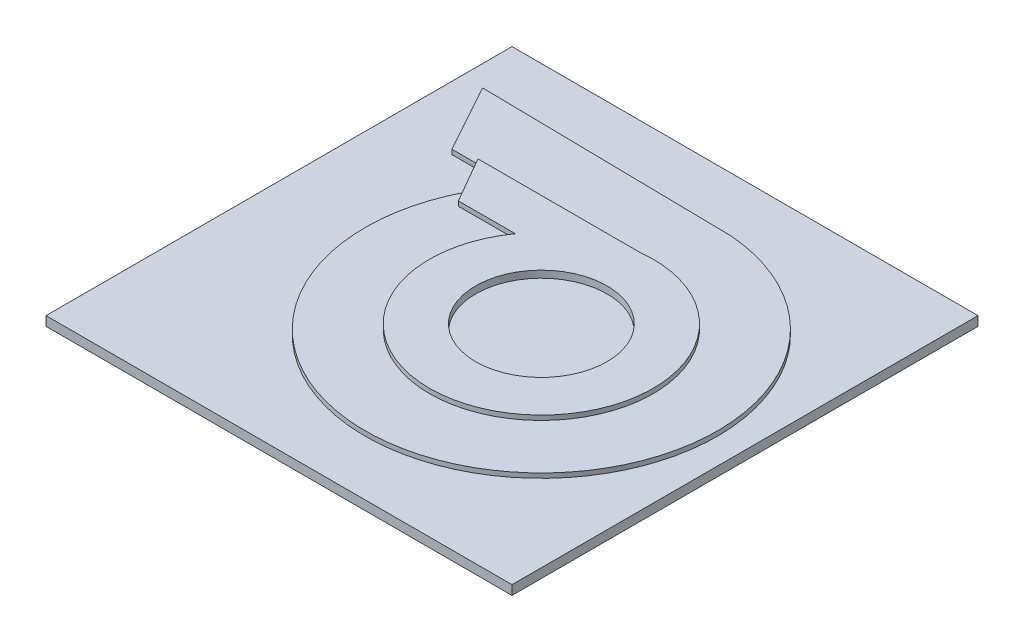
ISO-10303-21;
HEADER;
FILE_DESCRIPTION(('STEP AP214'),'2;1');
FILE_NAME('part.step','',(''),(''),'','','');
FILE_SCHEMA(('AUTOMOTIVE_DESIGN { 1 0 10303 214 1 1 1 1 }'));
ENDSEC;
DATA;
#1=APPLICATION_CONTEXT('core data for automotive mechanical design processes');
#2=APPLICATION_PROTOCOL_DEFINITION('international standard','automotive_design',2000,#1);
#3=PRODUCT_CONTEXT('',#1,'mechanical');
#4=PRODUCT('Part','Part','',(#3));
#5=PRODUCT_RELATED_PRODUCT_CATEGORY('part','',(#4));
#6=PRODUCT_DEFINITION_FORMATION('','',#4);
#7=PRODUCT_DEFINITION_CONTEXT('part definition',#1,'design');
#8=PRODUCT_DEFINITION('design','',#6,#7);
#9=PRODUCT_DEFINITION_SHAPE('','',#8);
#10=(LENGTH_UNIT() NAMED_UNIT(*) SI_UNIT(.MILLI.,.METRE.));
#11=(NAMED_UNIT(*) PLANE_ANGLE_UNIT() SI_UNIT($,.RADIAN.));
#12=(NAMED_UNIT(*) SI_UNIT($,.STERADIAN.) SOLID_ANGLE_UNIT());
#13=UNCERTAINTY_MEASURE_WITH_UNIT(LENGTH_MEASURE(1.E-05),#10,'distance_accuracy_value','');
#14=(GEOMETRIC_REPRESENTATION_CONTEXT(3) GLOBAL_UNCERTAINTY_ASSIGNED_CONTEXT((#13)) GLOBAL_UNIT_ASSIGNED_CONTEXT((#10,
#11,#12)) REPRESENTATION_CONTEXT('',''));
#15=CARTESIAN_POINT('',(0.,0.,0.));
#16=DIRECTION('',(0.,0.,1.));
#17=DIRECTION('',(1.,0.,0.));
#18=AXIS2_PLACEMENT_3D('',#15,#16,#17);
#19=CARTESIAN_POINT('',(-50.,2.,-50.));
#20=DIRECTION('',(1.,0.,0.));
#21=DIRECTION('',(0.,0.,-1.));
#22=AXIS2_PLACEMENT_3D('',#19,#20,#21);
#23=PLANE('',#22);
#24=DIRECTION('',(0.,0.,1.));
#25=VECTOR('',#24,1.);
#26=CARTESIAN_POINT('',(-50.,0.,-50.));
#27=LINE('',#26,#25);
#28=CARTESIAN_POINT('',(-50.,0.,-50.));
#29=VERTEX_POINT('',#28);
#30=CARTESIAN_POINT('',(-50.,0.,50.));
#31=VERTEX_POINT('',#30);
#32=EDGE_CURVE('E246',#29,#31,#27,.T.);
#33=ORIENTED_EDGE('',*,*,#32,.T.);
#34=DIRECTION('',(0.,-1.,0.));
#35=VECTOR('',#34,1.);
#36=CARTESIAN_POINT('',(-50.,2.,50.));
#37=LINE('',#36,#35);
#38=CARTESIAN_POINT('',(-50.,2.,50.));
#39=VERTEX_POINT('',#38);
#40=EDGE_CURVE('E74',#39,#31,#37,.T.);
#41=ORIENTED_EDGE('',*,*,#40,.F.);
#42=DIRECTION('',(0.,0.,1.));
#43=VECTOR('',#42,1.);
#44=CARTESIAN_POINT('',(-50.,2.,-50.));
#45=LINE('',#44,#43);
#46=CARTESIAN_POINT('',(-50.,2.,-50.));
#47=VERTEX_POINT('',#46);
#48=EDGE_CURVE('E247',#47,#39,#45,.T.);
#49=ORIENTED_EDGE('',*,*,#48,.F.);
#50=DIRECTION('',(0.,-1.,0.));
#51=VECTOR('',#50,1.);
#52=CARTESIAN_POINT('',(-50.,2.,-50.));
#53=LINE('',#52,#51);
#54=EDGE_CURVE('E261',#47,#29,#53,.T.);
#55=ORIENTED_EDGE('',*,*,#54,.T.);
#56=EDGE_LOOP('',(#33,#41,#49,#55));
#57=FACE_BOUND('',#56,.T.);
#58=ADVANCED_FACE('F71',(#57),#23,.F.);
#59=CARTESIAN_POINT('',(-50.,2.,50.));
#60=DIRECTION('',(0.,0.,-1.));
#61=DIRECTION('',(-1.,0.,0.));
#62=AXIS2_PLACEMENT_3D('',#59,#60,#61);
#63=PLANE('',#62);
#64=DIRECTION('',(1.,0.,0.));
#65=VECTOR('',#64,1.);
#66=CARTESIAN_POINT('',(-50.,0.,50.));
#67=LINE('',#66,#65);
#68=CARTESIAN_POINT('',(50.,0.,50.));
#69=VERTEX_POINT('',#68);
#70=EDGE_CURVE('E265',#31,#69,#67,.T.);
#71=ORIENTED_EDGE('',*,*,#70,.T.);
#72=DIRECTION('',(0.,-1.,0.));
#73=VECTOR('',#72,1.);
#74=CARTESIAN_POINT('',(50.,2.,50.));
#75=LINE('',#74,#73);
#76=CARTESIAN_POINT('',(50.,2.,50.));
#77=VERTEX_POINT('',#76);
#78=EDGE_CURVE('E279',#77,#69,#75,.T.);
#79=ORIENTED_EDGE('',*,*,#78,.F.);
#80=DIRECTION('',(1.,0.,0.));
#81=VECTOR('',#80,1.);
#82=CARTESIAN_POINT('',(-50.,2.,50.));
#83=LINE('',#82,#81);
#84=EDGE_CURVE('E251',#39,#77,#83,.T.);
#85=ORIENTED_EDGE('',*,*,#84,.F.);
#86=ORIENTED_EDGE('',*,*,#40,.T.);
#87=EDGE_LOOP('',(#71,#79,#85,#86));
#88=FACE_BOUND('',#87,.T.);
#89=ADVANCED_FACE('F290',(#88),#63,.F.);
#90=CARTESIAN_POINT('',(50.,2.,-50.));
#91=DIRECTION('',(-1.,0.,0.));
#92=DIRECTION('',(0.,0.,1.));
#93=AXIS2_PLACEMENT_3D('',#90,#91,#92);
#94=PLANE('',#93);
#95=DIRECTION('',(0.,0.,-1.));
#96=VECTOR('',#95,1.);
#97=CARTESIAN_POINT('',(50.,0.,-50.));
#98=LINE('',#97,#96);
#99=CARTESIAN_POINT('',(50.,0.,-50.));
#100=VERTEX_POINT('',#99);
#101=EDGE_CURVE('E268',#69,#100,#98,.T.);
#102=ORIENTED_EDGE('',*,*,#101,.T.);
#103=DIRECTION('',(0.,-1.,0.));
#104=VECTOR('',#103,1.);
#105=CARTESIAN_POINT('',(50.,2.,-50.));
#106=LINE('',#105,#104);
#107=CARTESIAN_POINT('',(50.,2.,-50.));
#108=VERTEX_POINT('',#107);
#109=EDGE_CURVE('E276',#108,#100,#106,.T.);
#110=ORIENTED_EDGE('',*,*,#109,.F.);
#111=DIRECTION('',(0.,0.,-1.));
#112=VECTOR('',#111,1.);
#113=CARTESIAN_POINT('',(50.,2.,-50.));
#114=LINE('',#113,#112);
#115=EDGE_CURVE('E255',#77,#108,#114,.T.);
#116=ORIENTED_EDGE('',*,*,#115,.F.);
#117=ORIENTED_EDGE('',*,*,#78,.T.);
#118=EDGE_LOOP('',(#102,#110,#116,#117));
#119=FACE_BOUND('',#118,.T.);
#120=ADVANCED_FACE('F299',(#119),#94,.F.);
#121=CARTESIAN_POINT('',(-50.,2.,-50.));
#122=DIRECTION('',(0.,0.,1.));
#123=DIRECTION('',(1.,0.,0.));
#124=AXIS2_PLACEMENT_3D('',#121,#122,#123);
#125=PLANE('',#124);
#126=DIRECTION('',(-1.,0.,0.));
#127=VECTOR('',#126,1.);
#128=CARTESIAN_POINT('',(-50.,0.,-50.));
#129=LINE('',#128,#127);
#130=EDGE_CURVE('E252',#100,#29,#129,.T.);
#131=ORIENTED_EDGE('',*,*,#130,.T.);
#132=ORIENTED_EDGE('',*,*,#54,.F.);
#133=DIRECTION('',(-1.,0.,0.));
#134=VECTOR('',#133,1.);
#135=CARTESIAN_POINT('',(-50.,2.,-50.));
#136=LINE('',#135,#134);
#137=EDGE_CURVE('E258',#108,#47,#136,.T.);
#138=ORIENTED_EDGE('',*,*,#137,.F.);
#139=ORIENTED_EDGE('',*,*,#109,.T.);
#140=EDGE_LOOP('',(#131,#132,#138,#139));
#141=FACE_BOUND('',#140,.T.);
#142=ADVANCED_FACE('F302',(#141),#125,.F.);
#143=CARTESIAN_POINT('',(0.,2.,0.));
#144=DIRECTION('',(0.,1.,0.));
#145=DIRECTION('',(0.,0.,1.));
#146=AXIS2_PLACEMENT_3D('',#143,#144,#145);
#147=PLANE('',#146);
#148=DIRECTION('',(0.498964444867146,0.,0.866622456874053));
#149=VECTOR('',#148,1.);
#150=CARTESIAN_POINT('',(-30.8341006366338,2.,-23.5717088899984));
#151=LINE('',#150,#149);
#152=CARTESIAN_POINT('',(-30.7809942028032,2.,-23.4794713996611));
#153=VERTEX_POINT('',#152);
#154=CARTESIAN_POINT('',(-26.9748024784057,2.,-16.8687173520269));
#155=VERTEX_POINT('',#154);
#156=EDGE_CURVE('E188',#153,#155,#151,.T.);
#157=ORIENTED_EDGE('',*,*,#156,.F.);
#158=DIRECTION('',(1.,0.,0.));
#159=VECTOR('',#158,1.);
#160=CARTESIAN_POINT('',(-36.3730302687271,2.,-23.4794713996611));
#161=LINE('',#160,#159);
#162=CARTESIAN_POINT('',(-36.3730302687271,2.,-23.4794713996611));
#163=VERTEX_POINT('',#162);
#164=EDGE_CURVE('E218',#163,#153,#161,.T.);
#165=ORIENTED_EDGE('',*,*,#164,.F.);
#166=DIRECTION('',(0.482604753647141,0.,0.87583825661887));
#167=VECTOR('',#166,1.);
#168=CARTESIAN_POINT('',(-44.4637049264599,2.,-38.1625476303611));
#169=LINE('',#168,#167);
#170=CARTESIAN_POINT('',(-44.4637049264599,2.,-38.1625476303611));
#171=VERTEX_POINT('',#170);
#172=EDGE_CURVE('E193',#171,#163,#169,.T.);
#173=ORIENTED_EDGE('',*,*,#172,.F.);
#174=DIRECTION('',(0.999875736676544,0.,0.0157642381845526));
#175=VECTOR('',#174,1.);
#176=CARTESIAN_POINT('',(-44.4637049264599,2.,-38.1625476303611));
#177=LINE('',#176,#175);
#178=CARTESIAN_POINT('',(9.74071455156101,2.,-37.3079500559194));
#179=VERTEX_POINT('',#178);
#180=EDGE_CURVE('E204',#171,#179,#177,.T.);
#181=ORIENTED_EDGE('',*,*,#180,.T.);
#182=CARTESIAN_POINT('',(6.6658156921361,2.,0.364658396037882));
#183=DIRECTION('',(0.,1.,0.));
#184=DIRECTION('',(0.,0.,1.));
#185=AXIS2_PLACEMENT_3D('',#182,#183,#184);
#186=CIRCLE('',#185,37.7978892343233);
#187=EDGE_CURVE('E222',#155,#179,#186,.T.);
#188=ORIENTED_EDGE('',*,*,#187,.F.);
#189=EDGE_LOOP('',(#157,#165,#173,#181,#188));
#190=FACE_BOUND('',#189,.T.);
#191=ORIENTED_EDGE('',*,*,#48,.T.);
#192=ORIENTED_EDGE('',*,*,#84,.T.);
#193=ORIENTED_EDGE('',*,*,#115,.T.);
#194=ORIENTED_EDGE('',*,*,#137,.T.);
#195=EDGE_LOOP('',(#191,#192,#193,#194));
#196=FACE_BOUND('',#195,.T.);
#197=ADVANCED_FACE('F304',(#190,#196),#147,.T.);
#198=CARTESIAN_POINT('',(0.,0.,0.));
#199=DIRECTION('',(0.,1.,0.));
#200=DIRECTION('',(0.,0.,1.));
#201=AXIS2_PLACEMENT_3D('',#198,#199,#200);
#202=PLANE('',#201);
#203=ORIENTED_EDGE('',*,*,#32,.F.);
#204=ORIENTED_EDGE('',*,*,#130,.F.);
#205=ORIENTED_EDGE('',*,*,#101,.F.);
#206=ORIENTED_EDGE('',*,*,#70,.F.);
#207=EDGE_LOOP('',(#203,#204,#205,#206));
#208=FACE_BOUND('',#207,.T.);
#209=ADVANCED_FACE('F297',(#208),#202,.F.);
#210=CARTESIAN_POINT('',(6.6658156921361,3.,0.364658396037882));
#211=DIRECTION('',(0.,1.,0.));
#212=DIRECTION('',(0.,0.,1.));
#213=AXIS2_PLACEMENT_3D('',#210,#211,#212);
#214=PLANE('',#213);
#215=DIRECTION('',(0.498964444867147,0.,0.866622456874053));
#216=VECTOR('',#215,1.);
#217=CARTESIAN_POINT('',(-30.7809942028031,3.,-23.4794713996611));
#218=LINE('',#217,#216);
#219=CARTESIAN_POINT('',(-26.9748024784057,3.,-16.8687173520269));
#220=VERTEX_POINT('',#219);
#221=CARTESIAN_POINT('',(-25.0717356927442,3.,-13.563390829564));
#222=VERTEX_POINT('',#221);
#223=EDGE_CURVE('E12',#220,#222,#218,.T.);
#224=ORIENTED_EDGE('',*,*,#223,.F.);
#225=CARTESIAN_POINT('',(6.6658156921361,3.,0.364658396037882));
#226=DIRECTION('',(0.,1.,0.));
#227=DIRECTION('',(0.,0.,1.));
#228=AXIS2_PLACEMENT_3D('',#225,#226,#227);
#229=CIRCLE('',#228,37.7978892343233);
#230=CARTESIAN_POINT('',(9.74071455156101,3.,-37.3079500559194));
#231=VERTEX_POINT('',#230);
#232=EDGE_CURVE('E207',#220,#231,#229,.T.);
#233=ORIENTED_EDGE('',*,*,#232,.T.);
#234=DIRECTION('',(0.999875736676544,0.,0.0157642381845526));
#235=VECTOR('',#234,1.);
#236=CARTESIAN_POINT('',(-44.4637049264599,3.,-38.1625476303611));
#237=LINE('',#236,#235);
#238=CARTESIAN_POINT('',(-44.4637049264599,3.,-38.1625476303611));
#239=VERTEX_POINT('',#238);
#240=EDGE_CURVE('E210',#239,#231,#237,.T.);
#241=ORIENTED_EDGE('',*,*,#240,.F.);
#242=DIRECTION('',(0.482604753647141,0.,0.87583825661887));
#243=VECTOR('',#242,1.);
#244=CARTESIAN_POINT('',(-44.4637049264599,3.,-38.1625476303611));
#245=LINE('',#244,#243);
#246=CARTESIAN_POINT('',(-36.3730302687271,3.,-23.4794713996611));
#247=VERTEX_POINT('',#246);
#248=EDGE_CURVE('E199',#239,#247,#245,.T.);
#249=ORIENTED_EDGE('',*,*,#248,.T.);
#250=DIRECTION('',(1.,0.,0.));
#251=VECTOR('',#250,1.);
#252=CARTESIAN_POINT('',(-36.3730302687271,3.,-23.4794713996611));
#253=LINE('',#252,#251);
#254=CARTESIAN_POINT('',(-30.7809942028032,3.,-23.4794713996611));
#255=VERTEX_POINT('',#254);
#256=EDGE_CURVE('E203',#247,#255,#253,.T.);
#257=ORIENTED_EDGE('',*,*,#256,.T.);
#258=DIRECTION('',(1.,0.,0.));
#259=VECTOR('',#258,1.);
#260=CARTESIAN_POINT('',(-30.7809942028031,3.,-23.4794713996611));
#261=LINE('',#260,#259);
#262=CARTESIAN_POINT('',(3.93497803935275,3.,-23.4794713996611));
#263=VERTEX_POINT('',#262);
#264=EDGE_CURVE('E87',#255,#263,#261,.T.);
#265=ORIENTED_EDGE('',*,*,#264,.T.);
#266=CARTESIAN_POINT('',(6.66581569213555,3.,0.364658396037981));
#267=DIRECTION('',(0.,1.,0.));
#268=DIRECTION('',(0.,0.,1.));
#269=AXIS2_PLACEMENT_3D('',#266,#267,#268);
#270=CIRCLE('',#269,24.);
#271=CARTESIAN_POINT('',(-12.8657271303701,3.,-13.5823425350808));
#272=VERTEX_POINT('',#271);
#273=EDGE_CURVE('E480',#272,#263,#270,.T.);
#274=ORIENTED_EDGE('',*,*,#273,.F.);
#275=DIRECTION('',(0.999998794635276,0.,-0.0015526519235439));
#276=VECTOR('',#275,1.);
#277=CARTESIAN_POINT('',(-25.0717356927442,3.,-13.563390829564));
#278=LINE('',#277,#276);
#279=EDGE_CURVE('E93',#222,#272,#278,.T.);
#280=ORIENTED_EDGE('',*,*,#279,.F.);
#281=EDGE_LOOP('',(#224,#233,#241,#249,#257,#265,#274,#280));
#282=FACE_BOUND('',#281,.T.);
#283=ADVANCED_FACE('F312',(#282),#214,.T.);
#284=CARTESIAN_POINT('',(6.6658156921361,3.,0.364658396037882));
#285=DIRECTION('',(0.,-1.,0.));
#286=DIRECTION('',(0.,0.,-1.));
#287=AXIS2_PLACEMENT_3D('',#284,#285,#286);
#288=CYLINDRICAL_SURFACE('',#287,37.7978892343233);
#289=DIRECTION('',(0.,-1.,0.));
#290=VECTOR('',#289,1.);
#291=CARTESIAN_POINT('',(-26.9748024784057,3.,-16.8687173520269));
#292=LINE('',#291,#290);
#293=EDGE_CURVE('E238',#155,#220,#292,.F.);
#294=ORIENTED_EDGE('',*,*,#293,.F.);
#295=ORIENTED_EDGE('',*,*,#187,.T.);
#296=DIRECTION('',(0.,-1.,0.));
#297=VECTOR('',#296,1.);
#298=CARTESIAN_POINT('',(9.74071455156101,3.,-37.3079500559194));
#299=LINE('',#298,#297);
#300=EDGE_CURVE('E231',#231,#179,#299,.T.);
#301=ORIENTED_EDGE('',*,*,#300,.F.);
#302=ORIENTED_EDGE('',*,*,#232,.F.);
#303=EDGE_LOOP('',(#294,#295,#301,#302));
#304=FACE_BOUND('',#303,.T.);
#305=ADVANCED_FACE('F314',(#304),#288,.T.);
#306=CARTESIAN_POINT('',(-44.4637049264599,3.,-38.1625476303611));
#307=DIRECTION('',(0.0157642381845526,0.,-0.999875736676544));
#308=DIRECTION('',(-0.999875736676544,0.,-0.0157642381845526));
#309=AXIS2_PLACEMENT_3D('',#306,#307,#308);
#310=PLANE('',#309);
#311=ORIENTED_EDGE('',*,*,#180,.F.);
#312=DIRECTION('',(0.,-1.,0.));
#313=VECTOR('',#312,1.);
#314=CARTESIAN_POINT('',(-44.4637049264599,3.,-38.1625476303611));
#315=LINE('',#314,#313);
#316=EDGE_CURVE('E214',#239,#171,#315,.T.);
#317=ORIENTED_EDGE('',*,*,#316,.F.);
#318=ORIENTED_EDGE('',*,*,#240,.T.);
#319=ORIENTED_EDGE('',*,*,#300,.T.);
#320=EDGE_LOOP('',(#311,#317,#318,#319));
#321=FACE_BOUND('',#320,.T.);
#322=ADVANCED_FACE('F366',(#321),#310,.T.);
#323=CARTESIAN_POINT('',(-44.4637049264599,3.,-38.1625476303611));
#324=DIRECTION('',(0.87583825661887,0.,-0.482604753647141));
#325=DIRECTION('',(-0.482604753647141,0.,-0.87583825661887));
#326=AXIS2_PLACEMENT_3D('',#323,#324,#325);
#327=PLANE('',#326);
#328=ORIENTED_EDGE('',*,*,#172,.T.);
#329=DIRECTION('',(0.,-1.,0.));
#330=VECTOR('',#329,1.);
#331=CARTESIAN_POINT('',(-36.3730302687271,3.,-23.4794713996611));
#332=LINE('',#331,#330);
#333=EDGE_CURVE('E235',#247,#163,#332,.T.);
#334=ORIENTED_EDGE('',*,*,#333,.F.);
#335=ORIENTED_EDGE('',*,*,#248,.F.);
#336=ORIENTED_EDGE('',*,*,#316,.T.);
#337=EDGE_LOOP('',(#328,#334,#335,#336));
#338=FACE_BOUND('',#337,.T.);
#339=ADVANCED_FACE('F377',(#338),#327,.F.);
#340=CARTESIAN_POINT('',(-36.3730302687271,3.,-23.4794713996611));
#341=DIRECTION('',(0.,0.,-1.));
#342=DIRECTION('',(-1.,0.,0.));
#343=AXIS2_PLACEMENT_3D('',#340,#341,#342);
#344=PLANE('',#343);
#345=DIRECTION('',(0.,-1.,0.));
#346=VECTOR('',#345,1.);
#347=CARTESIAN_POINT('',(-30.7809942028032,3.,-23.4794713996611));
#348=LINE('',#347,#346);
#349=EDGE_CURVE('E242',#255,#153,#348,.T.);
#350=ORIENTED_EDGE('',*,*,#349,.F.);
#351=ORIENTED_EDGE('',*,*,#256,.F.);
#352=ORIENTED_EDGE('',*,*,#333,.T.);
#353=ORIENTED_EDGE('',*,*,#164,.T.);
#354=EDGE_LOOP('',(#350,#351,#352,#353));
#355=FACE_BOUND('',#354,.T.);
#356=ADVANCED_FACE('F352',(#355),#344,.F.);
#357=CARTESIAN_POINT('',(-30.8341006366338,3.,-23.5717088899984));
#358=DIRECTION('',(0.866622456874053,0.,-0.498964444867146));
#359=DIRECTION('',(-0.498964444867146,0.,-0.866622456874053));
#360=AXIS2_PLACEMENT_3D('',#357,#358,#359);
#361=PLANE('',#360);
#362=ORIENTED_EDGE('',*,*,#293,.T.);
#363=ORIENTED_EDGE('',*,*,#223,.T.);
#364=DIRECTION('',(0.,-1.,0.));
#365=VECTOR('',#364,1.);
#366=CARTESIAN_POINT('',(-25.0717356927442,4.,-13.563390829564));
#367=LINE('',#366,#365);
#368=CARTESIAN_POINT('',(-25.0717356927442,4.,-13.563390829564));
#369=VERTEX_POINT('',#368);
#370=EDGE_CURVE('E167',#369,#222,#367,.T.);
#371=ORIENTED_EDGE('',*,*,#370,.F.);
#372=DIRECTION('',(0.498964444867147,0.,0.866622456874053));
#373=VECTOR('',#372,1.);
#374=CARTESIAN_POINT('',(-30.7809942028031,4.,-23.4794713996611));
#375=LINE('',#374,#373);
#376=CARTESIAN_POINT('',(-30.7809942028031,4.,-23.4794713996611));
#377=VERTEX_POINT('',#376);
#378=EDGE_CURVE('E174',#377,#369,#375,.T.);
#379=ORIENTED_EDGE('',*,*,#378,.F.);
#380=DIRECTION('',(0.,-1.,0.));
#381=VECTOR('',#380,1.);
#382=CARTESIAN_POINT('',(-30.7809942028031,4.,-23.4794713996611));
#383=LINE('',#382,#381);
#384=EDGE_CURVE('E488',#377,#255,#383,.T.);
#385=ORIENTED_EDGE('',*,*,#384,.T.);
#386=ORIENTED_EDGE('',*,*,#349,.T.);
#387=ORIENTED_EDGE('',*,*,#156,.T.);
#388=EDGE_LOOP('',(#362,#363,#371,#379,#385,#386,#387));
#389=FACE_BOUND('',#388,.T.);
#390=ADVANCED_FACE('F186',(#389),#361,.F.);
#391=CARTESIAN_POINT('',(-25.0717356927442,4.,-13.563390829564));
#392=DIRECTION('',(-0.0015526519235439,0.,-0.999998794635276));
#393=DIRECTION('',(-0.999998794635276,0.,0.0015526519235439));
#394=AXIS2_PLACEMENT_3D('',#391,#392,#393);
#395=PLANE('',#394);
#396=ORIENTED_EDGE('',*,*,#279,.T.);
#397=DIRECTION('',(0.,-1.,0.));
#398=VECTOR('',#397,1.);
#399=CARTESIAN_POINT('',(-12.8657271303701,4.,-13.5823425350808));
#400=LINE('',#399,#398);
#401=CARTESIAN_POINT('',(-12.8657271303701,4.,-13.5823425350808));
#402=VERTEX_POINT('',#401);
#403=EDGE_CURVE('E169',#402,#272,#400,.T.);
#404=ORIENTED_EDGE('',*,*,#403,.F.);
#405=DIRECTION('',(0.999998794635276,0.,-0.0015526519235439));
#406=VECTOR('',#405,1.);
#407=CARTESIAN_POINT('',(-25.0717356927442,4.,-13.563390829564));
#408=LINE('',#407,#406);
#409=EDGE_CURVE('E163',#369,#402,#408,.T.);
#410=ORIENTED_EDGE('',*,*,#409,.F.);
#411=ORIENTED_EDGE('',*,*,#370,.T.);
#412=EDGE_LOOP('',(#396,#404,#410,#411));
#413=FACE_BOUND('',#412,.T.);
#414=ADVANCED_FACE('F165',(#413),#395,.F.);
#415=CARTESIAN_POINT('',(6.66581569213555,4.,0.364658396037981));
#416=DIRECTION('',(0.,-1.,0.));
#417=DIRECTION('',(0.,0.,-1.));
#418=AXIS2_PLACEMENT_3D('',#415,#416,#417);
#419=CYLINDRICAL_SURFACE('',#418,24.);
#420=ORIENTED_EDGE('',*,*,#273,.T.);
#421=DIRECTION('',(0.,-1.,0.));
#422=VECTOR('',#421,1.);
#423=CARTESIAN_POINT('',(3.93497803935275,4.,-23.4794713996611));
#424=LINE('',#423,#422);
#425=CARTESIAN_POINT('',(3.93497803935275,4.,-23.4794713996611));
#426=VERTEX_POINT('',#425);
#427=EDGE_CURVE('E195',#426,#263,#424,.T.);
#428=ORIENTED_EDGE('',*,*,#427,.F.);
#429=CARTESIAN_POINT('',(6.66581569213555,4.,0.364658396037981));
#430=DIRECTION('',(0.,1.,0.));
#431=DIRECTION('',(0.,0.,1.));
#432=AXIS2_PLACEMENT_3D('',#429,#430,#431);
#433=CIRCLE('',#432,24.);
#434=EDGE_CURVE('E173',#402,#426,#433,.T.);
#435=ORIENTED_EDGE('',*,*,#434,.F.);
#436=ORIENTED_EDGE('',*,*,#403,.T.);
#437=EDGE_LOOP('',(#420,#428,#435,#436));
#438=FACE_BOUND('',#437,.T.);
#439=ADVANCED_FACE('F416',(#438),#419,.T.);
#440=CARTESIAN_POINT('',(-30.7809942028031,4.,-23.4794713996611));
#441=DIRECTION('',(0.,0.,-1.));
#442=DIRECTION('',(-1.,0.,0.));
#443=AXIS2_PLACEMENT_3D('',#440,#441,#442);
#444=PLANE('',#443);
#445=ORIENTED_EDGE('',*,*,#264,.F.);
#446=ORIENTED_EDGE('',*,*,#384,.F.);
#447=DIRECTION('',(1.,0.,0.));
#448=VECTOR('',#447,1.);
#449=CARTESIAN_POINT('',(-30.7809942028031,4.,-23.4794713996611));
#450=LINE('',#449,#448);
#451=EDGE_CURVE('E180',#377,#426,#450,.T.);
#452=ORIENTED_EDGE('',*,*,#451,.T.);
#453=ORIENTED_EDGE('',*,*,#427,.T.);
#454=EDGE_LOOP('',(#445,#446,#452,#453));
#455=FACE_BOUND('',#454,.T.);
#456=ADVANCED_FACE('F426',(#455),#444,.T.);
#457=CARTESIAN_POINT('',(6.66581569213555,4.,0.364658396037981));
#458=DIRECTION('',(0.,1.,0.));
#459=DIRECTION('',(0.,0.,1.));
#460=AXIS2_PLACEMENT_3D('',#457,#458,#459);
#461=PLANE('',#460);
#462=CARTESIAN_POINT('',(6.66581569213555,4.,0.364658396037981));
#463=DIRECTION('',(0.,1.,0.));
#464=DIRECTION('',(0.,0.,1.));
#465=AXIS2_PLACEMENT_3D('',#462,#463,#464);
#466=CIRCLE('',#465,14.1023342651551);
#467=CARTESIAN_POINT('',(6.66581569213555,4.,14.4669926611931));
#468=VERTEX_POINT('',#467);
#469=EDGE_CURVE('E476',#468,#468,#466,.T.);
#470=ORIENTED_EDGE('',*,*,#469,.F.);
#471=EDGE_LOOP('',(#470));
#472=FACE_BOUND('',#471,.T.);
#473=ORIENTED_EDGE('',*,*,#378,.T.);
#474=ORIENTED_EDGE('',*,*,#409,.T.);
#475=ORIENTED_EDGE('',*,*,#434,.T.);
#476=ORIENTED_EDGE('',*,*,#451,.F.);
#477=EDGE_LOOP('',(#473,#474,#475,#476));
#478=FACE_BOUND('',#477,.T.);
#479=ADVANCED_FACE('F178',(#472,#478),#461,.T.);
#480=CARTESIAN_POINT('',(6.66581569213555,2.5,0.364658396037981));
#481=DIRECTION('',(0.,1.,0.));
#482=DIRECTION('',(0.,0.,1.));
#483=AXIS2_PLACEMENT_3D('',#480,#481,#482);
#484=CYLINDRICAL_SURFACE('',#483,14.1023342651551);
#485=CARTESIAN_POINT('',(6.66581569213555,2.5,0.364658396037981));
#486=DIRECTION('',(0.,1.,0.));
#487=DIRECTION('',(0.,0.,1.));
#488=AXIS2_PLACEMENT_3D('',#485,#486,#487);
#489=CIRCLE('',#488,14.1023342651551);
#490=CARTESIAN_POINT('',(6.66581569213555,2.5,14.4669926611931));
#491=VERTEX_POINT('',#490);
#492=EDGE_CURVE('E474',#491,#491,#489,.T.);
#493=ORIENTED_EDGE('',*,*,#492,.F.);
#494=EDGE_LOOP('',(#493));
#495=FACE_BOUND('',#494,.T.);
#496=ORIENTED_EDGE('',*,*,#469,.T.);
#497=EDGE_LOOP('',(#496));
#498=FACE_BOUND('',#497,.T.);
#499=ADVANCED_FACE('F447',(#495,#498),#484,.F.);
#500=CARTESIAN_POINT('',(6.66581569213555,2.5,0.364658396037981));
#501=DIRECTION('',(0.,1.,0.));
#502=DIRECTION('',(0.,0.,1.));
#503=AXIS2_PLACEMENT_3D('',#500,#501,#502);
#504=PLANE('',#503);
#505=ORIENTED_EDGE('',*,*,#492,.T.);
#506=EDGE_LOOP('',(#505));
#507=FACE_BOUND('',#506,.T.);
#508=ADVANCED_FACE('F458',(#507),#504,.T.);
#509=CLOSED_SHELL('',(#58,#89,#120,#142,#197,#209,#283,#305,#322,#339,#356,#390,#414,#439,#456,
#479,#499,#508));
#510=MANIFOLD_SOLID_BREP('B2',#509);
#511=ADVANCED_BREP_SHAPE_REPRESENTATION('',(#18,#510),#14);
#512=SHAPE_DEFINITION_REPRESENTATION(#9,#511);
ENDSEC;
END-ISO-10303-21;
